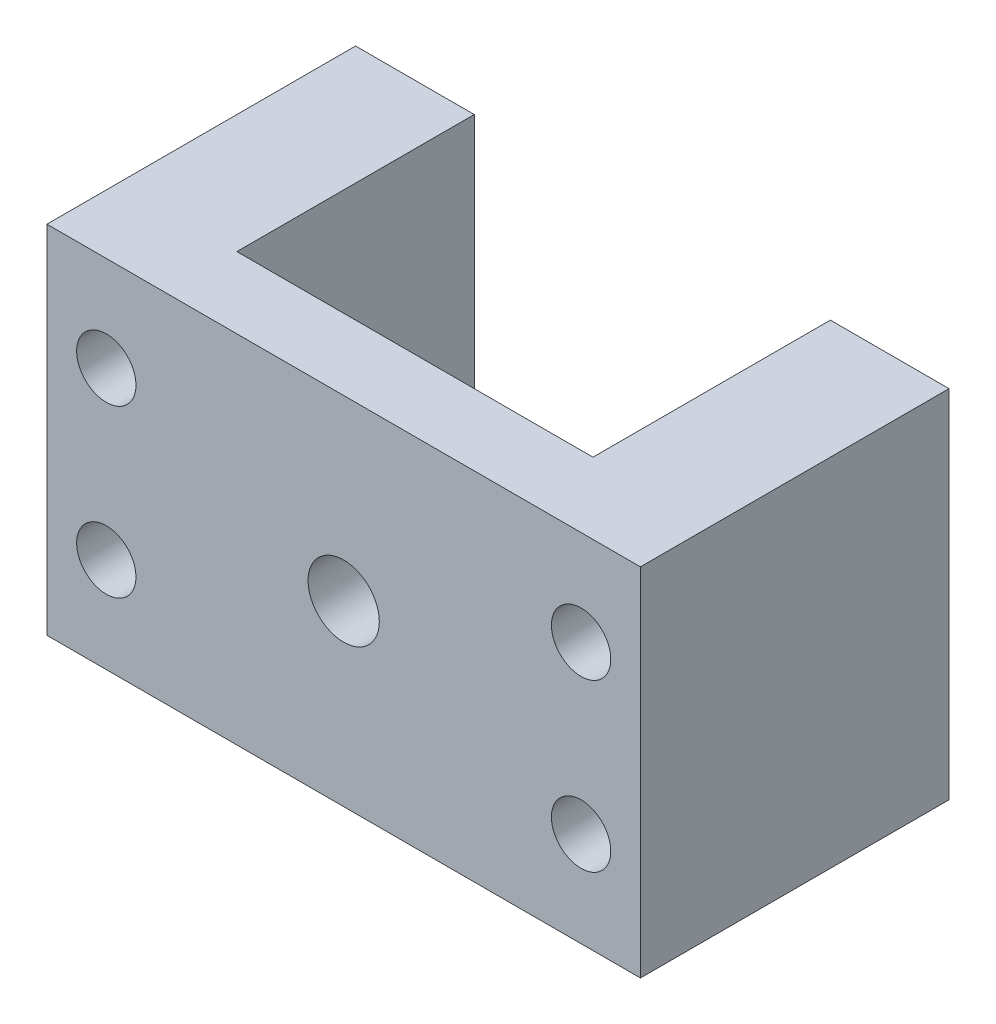
ISO-10303-21;
HEADER;
FILE_DESCRIPTION(('STEP AP214'),'2;1');
FILE_NAME('part.step','',(''),(''),'','','');
FILE_SCHEMA(('AUTOMOTIVE_DESIGN { 1 0 10303 214 1 1 1 1 }'));
ENDSEC;
DATA;
#1=APPLICATION_CONTEXT('core data for automotive mechanical design processes');
#2=APPLICATION_PROTOCOL_DEFINITION('international standard','automotive_design',2000,#1);
#3=PRODUCT_CONTEXT('',#1,'mechanical');
#4=PRODUCT('Part','Part','',(#3));
#5=PRODUCT_RELATED_PRODUCT_CATEGORY('part','',(#4));
#6=PRODUCT_DEFINITION_FORMATION('','',#4);
#7=PRODUCT_DEFINITION_CONTEXT('part definition',#1,'design');
#8=PRODUCT_DEFINITION('design','',#6,#7);
#9=PRODUCT_DEFINITION_SHAPE('','',#8);
#10=(LENGTH_UNIT() NAMED_UNIT(*) SI_UNIT(.MILLI.,.METRE.));
#11=(NAMED_UNIT(*) PLANE_ANGLE_UNIT() SI_UNIT($,.RADIAN.));
#12=(NAMED_UNIT(*) SI_UNIT($,.STERADIAN.) SOLID_ANGLE_UNIT());
#13=UNCERTAINTY_MEASURE_WITH_UNIT(LENGTH_MEASURE(1.E-05),#10,'distance_accuracy_value','');
#14=(GEOMETRIC_REPRESENTATION_CONTEXT(3) GLOBAL_UNCERTAINTY_ASSIGNED_CONTEXT((#13)) GLOBAL_UNIT_ASSIGNED_CONTEXT((#10,
#11,#12)) REPRESENTATION_CONTEXT('',''));
#15=CARTESIAN_POINT('',(0.,0.,0.));
#16=DIRECTION('',(0.,0.,1.));
#17=DIRECTION('',(1.,0.,0.));
#18=AXIS2_PLACEMENT_3D('',#15,#16,#17);
#19=CARTESIAN_POINT('',(-5.,15.,0.));
#20=DIRECTION('',(1.,0.,0.));
#21=DIRECTION('',(0.,0.,-1.));
#22=AXIS2_PLACEMENT_3D('',#19,#20,#21);
#23=PLANE('',#22);
#24=DIRECTION('',(0.,-1.,0.));
#25=VECTOR('',#24,1.);
#26=CARTESIAN_POINT('',(-5.,15.,14.));
#27=LINE('',#26,#25);
#28=CARTESIAN_POINT('',(-5.,15.,14.));
#29=VERTEX_POINT('',#28);
#30=CARTESIAN_POINT('',(-5.,0.,14.));
#31=VERTEX_POINT('',#30);
#32=EDGE_CURVE('E52',#29,#31,#27,.T.);
#33=ORIENTED_EDGE('',*,*,#32,.F.);
#34=DIRECTION('',(0.,0.,1.));
#35=VECTOR('',#34,1.);
#36=CARTESIAN_POINT('',(-5.,15.,0.));
#37=LINE('',#36,#35);
#38=CARTESIAN_POINT('',(-5.,15.,1.));
#39=VERTEX_POINT('',#38);
#40=EDGE_CURVE('E165',#39,#29,#37,.T.);
#41=ORIENTED_EDGE('',*,*,#40,.F.);
#42=DIRECTION('',(0.,1.,0.));
#43=VECTOR('',#42,1.);
#44=CARTESIAN_POINT('',(-5.,15.,1.));
#45=LINE('',#44,#43);
#46=CARTESIAN_POINT('',(-5.,0.,1.));
#47=VERTEX_POINT('',#46);
#48=EDGE_CURVE('E151',#47,#39,#45,.T.);
#49=ORIENTED_EDGE('',*,*,#48,.F.);
#50=DIRECTION('',(0.,0.,1.));
#51=VECTOR('',#50,1.);
#52=CARTESIAN_POINT('',(-5.,0.,0.));
#53=LINE('',#52,#51);
#54=EDGE_CURVE('E120',#47,#31,#53,.T.);
#55=ORIENTED_EDGE('',*,*,#54,.T.);
#56=EDGE_LOOP('',(#33,#41,#49,#55));
#57=FACE_BOUND('',#56,.T.);
#58=ADVANCED_FACE('F35',(#57),#23,.F.);
#59=CARTESIAN_POINT('',(20.,15.,0.));
#60=DIRECTION('',(-1.,0.,0.));
#61=DIRECTION('',(0.,0.,1.));
#62=AXIS2_PLACEMENT_3D('',#59,#60,#61);
#63=PLANE('',#62);
#64=DIRECTION('',(0.,1.,0.));
#65=VECTOR('',#64,1.);
#66=CARTESIAN_POINT('',(20.,15.,14.));
#67=LINE('',#66,#65);
#68=CARTESIAN_POINT('',(20.,0.,14.));
#69=VERTEX_POINT('',#68);
#70=CARTESIAN_POINT('',(20.,15.,14.));
#71=VERTEX_POINT('',#70);
#72=EDGE_CURVE('E104',#69,#71,#67,.T.);
#73=ORIENTED_EDGE('',*,*,#72,.F.);
#74=DIRECTION('',(0.,0.,-1.));
#75=VECTOR('',#74,1.);
#76=CARTESIAN_POINT('',(20.,0.,0.));
#77=LINE('',#76,#75);
#78=CARTESIAN_POINT('',(20.,0.,1.));
#79=VERTEX_POINT('',#78);
#80=EDGE_CURVE('E60',#69,#79,#77,.T.);
#81=ORIENTED_EDGE('',*,*,#80,.T.);
#82=DIRECTION('',(0.,-1.,0.));
#83=VECTOR('',#82,1.);
#84=CARTESIAN_POINT('',(20.,15.,1.));
#85=LINE('',#84,#83);
#86=CARTESIAN_POINT('',(20.,15.,1.));
#87=VERTEX_POINT('',#86);
#88=EDGE_CURVE('E180',#87,#79,#85,.T.);
#89=ORIENTED_EDGE('',*,*,#88,.F.);
#90=DIRECTION('',(0.,0.,-1.));
#91=VECTOR('',#90,1.);
#92=CARTESIAN_POINT('',(20.,15.,0.));
#93=LINE('',#92,#91);
#94=EDGE_CURVE('E112',#71,#87,#93,.T.);
#95=ORIENTED_EDGE('',*,*,#94,.F.);
#96=EDGE_LOOP('',(#73,#81,#89,#95));
#97=FACE_BOUND('',#96,.T.);
#98=ADVANCED_FACE('F111',(#97),#63,.F.);
#99=CARTESIAN_POINT('',(0.,15.,0.));
#100=DIRECTION('',(0.,1.,0.));
#101=DIRECTION('',(0.,0.,1.));
#102=AXIS2_PLACEMENT_3D('',#99,#100,#101);
#103=PLANE('',#102);
#104=ORIENTED_EDGE('',*,*,#40,.T.);
#105=DIRECTION('',(-1.,0.,0.));
#106=VECTOR('',#105,1.);
#107=CARTESIAN_POINT('',(-5.,15.,14.));
#108=LINE('',#107,#106);
#109=EDGE_CURVE('E113',#71,#29,#108,.T.);
#110=ORIENTED_EDGE('',*,*,#109,.F.);
#111=ORIENTED_EDGE('',*,*,#94,.T.);
#112=DIRECTION('',(1.,0.,0.));
#113=VECTOR('',#112,1.);
#114=CARTESIAN_POINT('',(20.,15.,1.));
#115=LINE('',#114,#113);
#116=CARTESIAN_POINT('',(15.,15.,1.));
#117=VERTEX_POINT('',#116);
#118=EDGE_CURVE('E145',#117,#87,#115,.T.);
#119=ORIENTED_EDGE('',*,*,#118,.F.);
#120=DIRECTION('',(0.,0.,1.));
#121=VECTOR('',#120,1.);
#122=CARTESIAN_POINT('',(15.,15.,0.));
#123=LINE('',#122,#121);
#124=CARTESIAN_POINT('',(15.,15.,11.));
#125=VERTEX_POINT('',#124);
#126=EDGE_CURVE('E169',#117,#125,#123,.T.);
#127=ORIENTED_EDGE('',*,*,#126,.T.);
#128=DIRECTION('',(-1.,0.,0.));
#129=VECTOR('',#128,1.);
#130=CARTESIAN_POINT('',(0.,15.,11.));
#131=LINE('',#130,#129);
#132=CARTESIAN_POINT('',(0.,15.,11.));
#133=VERTEX_POINT('',#132);
#134=EDGE_CURVE('E131',#125,#133,#131,.T.);
#135=ORIENTED_EDGE('',*,*,#134,.T.);
#136=DIRECTION('',(0.,0.,-1.));
#137=VECTOR('',#136,1.);
#138=CARTESIAN_POINT('',(0.,15.,0.));
#139=LINE('',#138,#137);
#140=CARTESIAN_POINT('',(0.,15.,1.));
#141=VERTEX_POINT('',#140);
#142=EDGE_CURVE('E129',#133,#141,#139,.T.);
#143=ORIENTED_EDGE('',*,*,#142,.T.);
#144=EDGE_CURVE('E139',#39,#141,#115,.T.);
#145=ORIENTED_EDGE('',*,*,#144,.F.);
#146=EDGE_LOOP('',(#104,#110,#111,#119,#127,#135,#143,#145));
#147=FACE_BOUND('',#146,.T.);
#148=ADVANCED_FACE('F220',(#147),#103,.T.);
#149=CARTESIAN_POINT('',(0.,0.,0.));
#150=DIRECTION('',(0.,1.,0.));
#151=DIRECTION('',(0.,0.,1.));
#152=AXIS2_PLACEMENT_3D('',#149,#150,#151);
#153=PLANE('',#152);
#154=DIRECTION('',(1.,0.,0.));
#155=VECTOR('',#154,1.);
#156=CARTESIAN_POINT('',(-5.,0.,14.));
#157=LINE('',#156,#155);
#158=EDGE_CURVE('E101',#31,#69,#157,.T.);
#159=ORIENTED_EDGE('',*,*,#158,.F.);
#160=ORIENTED_EDGE('',*,*,#54,.F.);
#161=DIRECTION('',(-1.,0.,0.));
#162=VECTOR('',#161,1.);
#163=CARTESIAN_POINT('',(20.,0.,1.));
#164=LINE('',#163,#162);
#165=CARTESIAN_POINT('',(0.,0.,1.));
#166=VERTEX_POINT('',#165);
#167=EDGE_CURVE('E178',#166,#47,#164,.T.);
#168=ORIENTED_EDGE('',*,*,#167,.F.);
#169=DIRECTION('',(0.,0.,-1.));
#170=VECTOR('',#169,1.);
#171=CARTESIAN_POINT('',(0.,0.,0.));
#172=LINE('',#171,#170);
#173=CARTESIAN_POINT('',(0.,0.,11.));
#174=VERTEX_POINT('',#173);
#175=EDGE_CURVE('E124',#174,#166,#172,.T.);
#176=ORIENTED_EDGE('',*,*,#175,.F.);
#177=DIRECTION('',(-1.,0.,0.));
#178=VECTOR('',#177,1.);
#179=CARTESIAN_POINT('',(0.,0.,11.));
#180=LINE('',#179,#178);
#181=CARTESIAN_POINT('',(15.,0.,11.));
#182=VERTEX_POINT('',#181);
#183=EDGE_CURVE('E122',#182,#174,#180,.T.);
#184=ORIENTED_EDGE('',*,*,#183,.F.);
#185=DIRECTION('',(0.,0.,1.));
#186=VECTOR('',#185,1.);
#187=CARTESIAN_POINT('',(15.,0.,0.));
#188=LINE('',#187,#186);
#189=CARTESIAN_POINT('',(15.,0.,1.));
#190=VERTEX_POINT('',#189);
#191=EDGE_CURVE('E119',#190,#182,#188,.T.);
#192=ORIENTED_EDGE('',*,*,#191,.F.);
#193=EDGE_CURVE('E118',#79,#190,#164,.T.);
#194=ORIENTED_EDGE('',*,*,#193,.F.);
#195=ORIENTED_EDGE('',*,*,#80,.F.);
#196=EDGE_LOOP('',(#159,#160,#168,#176,#184,#192,#194,#195));
#197=FACE_BOUND('',#196,.T.);
#198=ADVANCED_FACE('F116',(#197),#153,.F.);
#199=CARTESIAN_POINT('',(17.5,11.,15.));
#200=DIRECTION('',(0.,0.,-1.));
#201=DIRECTION('',(-1.,0.,0.));
#202=AXIS2_PLACEMENT_3D('',#199,#200,#201);
#203=CYLINDRICAL_SURFACE('',#202,1.25);
#204=CARTESIAN_POINT('',(17.5,11.,0.999999999999999));
#205=DIRECTION('',(0.,0.,-1.));
#206=DIRECTION('',(-1.,0.,0.));
#207=AXIS2_PLACEMENT_3D('',#204,#205,#206);
#208=CIRCLE('',#207,1.25);
#209=CARTESIAN_POINT('',(16.25,11.,1.));
#210=VERTEX_POINT('',#209);
#211=EDGE_CURVE('E157',#210,#210,#208,.F.);
#212=CARTESIAN_POINT('',(17.5,11.,14.));
#213=DIRECTION('',(0.,0.,1.));
#214=DIRECTION('',(1.,0.,0.));
#215=AXIS2_PLACEMENT_3D('',#212,#213,#214);
#216=CIRCLE('',#215,1.25);
#217=CARTESIAN_POINT('',(16.25,11.,14.));
#218=VERTEX_POINT('',#217);
#219=EDGE_CURVE('E181',#218,#218,#216,.F.);
#220=CARTESIAN_POINT('',(16.25,11.,1.));
#221=CARTESIAN_POINT('',(16.25,11.,1.13541666666667));
#222=CARTESIAN_POINT('',(16.25,11.,1.27083333333333));
#223=CARTESIAN_POINT('',(16.25,11.,1.54166666666667));
#224=CARTESIAN_POINT('',(16.25,11.,1.67708333333333));
#225=CARTESIAN_POINT('',(16.25,11.,1.94791666666667));
#226=CARTESIAN_POINT('',(16.25,11.,2.08333333333333));
#227=CARTESIAN_POINT('',(16.25,11.,2.35416666666667));
#228=CARTESIAN_POINT('',(16.25,11.,2.48958333333333));
#229=CARTESIAN_POINT('',(16.25,11.,2.76041666666667));
#230=CARTESIAN_POINT('',(16.25,11.,2.89583333333333));
#231=CARTESIAN_POINT('',(16.25,11.,3.16666666666667));
#232=CARTESIAN_POINT('',(16.25,11.,3.30208333333333));
#233=CARTESIAN_POINT('',(16.25,11.,3.57291666666667));
#234=CARTESIAN_POINT('',(16.25,11.,3.70833333333333));
#235=CARTESIAN_POINT('',(16.25,11.,3.97916666666667));
#236=CARTESIAN_POINT('',(16.25,11.,4.11458333333333));
#237=CARTESIAN_POINT('',(16.25,11.,4.38541666666667));
#238=CARTESIAN_POINT('',(16.25,11.,4.52083333333333));
#239=CARTESIAN_POINT('',(16.25,11.,4.79166666666667));
#240=CARTESIAN_POINT('',(16.25,11.,4.92708333333333));
#241=CARTESIAN_POINT('',(16.25,11.,5.19791666666667));
#242=CARTESIAN_POINT('',(16.25,11.,5.33333333333333));
#243=CARTESIAN_POINT('',(16.25,11.,5.60416666666667));
#244=CARTESIAN_POINT('',(16.25,11.,5.73958333333333));
#245=CARTESIAN_POINT('',(16.25,11.,6.01041666666667));
#246=CARTESIAN_POINT('',(16.25,11.,6.14583333333333));
#247=CARTESIAN_POINT('',(16.25,11.,6.41666666666667));
#248=CARTESIAN_POINT('',(16.25,11.,6.55208333333333));
#249=CARTESIAN_POINT('',(16.25,11.,6.82291666666667));
#250=CARTESIAN_POINT('',(16.25,11.,6.95833333333333));
#251=CARTESIAN_POINT('',(16.25,11.,7.22916666666667));
#252=CARTESIAN_POINT('',(16.25,11.,7.36458333333333));
#253=CARTESIAN_POINT('',(16.25,11.,7.63541666666667));
#254=CARTESIAN_POINT('',(16.25,11.,7.77083333333333));
#255=CARTESIAN_POINT('',(16.25,11.,8.04166666666667));
#256=CARTESIAN_POINT('',(16.25,11.,8.17708333333333));
#257=CARTESIAN_POINT('',(16.25,11.,8.44791666666666));
#258=CARTESIAN_POINT('',(16.25,11.,8.58333333333333));
#259=CARTESIAN_POINT('',(16.25,11.,8.85416666666666));
#260=CARTESIAN_POINT('',(16.25,11.,8.98958333333333));
#261=CARTESIAN_POINT('',(16.25,11.,9.26041666666666));
#262=CARTESIAN_POINT('',(16.25,11.,9.39583333333333));
#263=CARTESIAN_POINT('',(16.25,11.,9.66666666666667));
#264=CARTESIAN_POINT('',(16.25,11.,9.80208333333333));
#265=CARTESIAN_POINT('',(16.25,11.,10.0729166666667));
#266=CARTESIAN_POINT('',(16.25,11.,10.2083333333333));
#267=CARTESIAN_POINT('',(16.25,11.,10.4791666666667));
#268=CARTESIAN_POINT('',(16.25,11.,10.6145833333333));
#269=CARTESIAN_POINT('',(16.25,11.,10.8854166666667));
#270=CARTESIAN_POINT('',(16.25,11.,11.0208333333333));
#271=CARTESIAN_POINT('',(16.25,11.,11.2916666666667));
#272=CARTESIAN_POINT('',(16.25,11.,11.4270833333333));
#273=CARTESIAN_POINT('',(16.25,11.,11.6979166666667));
#274=CARTESIAN_POINT('',(16.25,11.,11.8333333333333));
#275=CARTESIAN_POINT('',(16.25,11.,12.1041666666667));
#276=CARTESIAN_POINT('',(16.25,11.,12.2395833333333));
#277=CARTESIAN_POINT('',(16.25,11.,12.5104166666667));
#278=CARTESIAN_POINT('',(16.25,11.,12.6458333333333));
#279=CARTESIAN_POINT('',(16.25,11.,12.9166666666667));
#280=CARTESIAN_POINT('',(16.25,11.,13.0520833333333));
#281=CARTESIAN_POINT('',(16.25,11.,13.3229166666667));
#282=CARTESIAN_POINT('',(16.25,11.,13.4583333333333));
#283=CARTESIAN_POINT('',(16.25,11.,13.7291666666667));
#284=CARTESIAN_POINT('',(16.25,11.,13.8645833333333));
#285=CARTESIAN_POINT('',(16.25,11.,14.));
#286=B_SPLINE_CURVE_WITH_KNOTS('',3,(#220,#221,#222,#223,#224,#225,#226,#227,#228,#229,#230,
#231,#232,#233,#234,#235,#236,#237,#238,#239,#240,#241,#242,#243,#244,#245,#246,#247,#248,#249,
#250,#251,#252,#253,#254,#255,#256,#257,#258,#259,#260,#261,#262,#263,#264,#265,#266,#267,#268,
#269,#270,#271,#272,#273,#274,#275,#276,#277,#278,#279,#280,#281,#282,#283,#284,#285),
.UNSPECIFIED.,.F.,.F.,(4,2,2,2,2,2,2,2,2,2,2,2,2,2,2,2,2,2,2,2,2,2,2,2,2,2,2,2,2,2,2,2,4),(0.,
0.40625,0.812500000000001,1.21875,1.625,2.03125,2.4375,2.84375,3.25,3.65625,4.0625,4.46875,
4.875,5.28125,5.6875,6.09375,6.5,6.90625,7.3125,7.71875,8.125,8.53125,8.9375,9.34375,9.75,
10.15625,10.5625,10.96875,11.375,11.78125,12.1875,12.59375,13.),.UNSPECIFIED.);
#287=EDGE_CURVE('BSEAM233',#210,#218,#286,.T.);
#288=ORIENTED_EDGE('',*,*,#211,.F.);
#289=ORIENTED_EDGE('',*,*,#219,.F.);
#290=ORIENTED_EDGE('',*,*,#287,.T.);
#291=ORIENTED_EDGE('',*,*,#287,.F.);
#292=EDGE_LOOP('',(#288,#290,#289,#291));
#293=FACE_BOUND('',#292,.T.);
#294=ADVANCED_FACE('F233',(#293),#203,.F.);
#295=CARTESIAN_POINT('',(17.5,4.,15.));
#296=DIRECTION('',(0.,0.,-1.));
#297=DIRECTION('',(-1.,0.,0.));
#298=AXIS2_PLACEMENT_3D('',#295,#296,#297);
#299=CYLINDRICAL_SURFACE('',#298,1.25);
#300=CARTESIAN_POINT('',(17.5,4.,0.999999999999999));
#301=DIRECTION('',(0.,0.,-1.));
#302=DIRECTION('',(-1.,0.,0.));
#303=AXIS2_PLACEMENT_3D('',#300,#301,#302);
#304=CIRCLE('',#303,1.25);
#305=CARTESIAN_POINT('',(16.25,4.,1.));
#306=VERTEX_POINT('',#305);
#307=EDGE_CURVE('E143',#306,#306,#304,.F.);
#308=CARTESIAN_POINT('',(17.5,4.,14.));
#309=DIRECTION('',(0.,0.,1.));
#310=DIRECTION('',(1.,0.,0.));
#311=AXIS2_PLACEMENT_3D('',#308,#309,#310);
#312=CIRCLE('',#311,1.25);
#313=CARTESIAN_POINT('',(16.25,4.,14.));
#314=VERTEX_POINT('',#313);
#315=EDGE_CURVE('E186',#314,#314,#312,.F.);
#316=CARTESIAN_POINT('',(16.25,4.,1.));
#317=CARTESIAN_POINT('',(16.25,4.,1.13541666666667));
#318=CARTESIAN_POINT('',(16.25,4.,1.27083333333333));
#319=CARTESIAN_POINT('',(16.25,4.,1.54166666666667));
#320=CARTESIAN_POINT('',(16.25,4.,1.67708333333333));
#321=CARTESIAN_POINT('',(16.25,4.,1.94791666666667));
#322=CARTESIAN_POINT('',(16.25,4.,2.08333333333333));
#323=CARTESIAN_POINT('',(16.25,4.,2.35416666666667));
#324=CARTESIAN_POINT('',(16.25,4.,2.48958333333333));
#325=CARTESIAN_POINT('',(16.25,4.,2.76041666666667));
#326=CARTESIAN_POINT('',(16.25,4.,2.89583333333333));
#327=CARTESIAN_POINT('',(16.25,4.,3.16666666666667));
#328=CARTESIAN_POINT('',(16.25,4.,3.30208333333333));
#329=CARTESIAN_POINT('',(16.25,4.,3.57291666666667));
#330=CARTESIAN_POINT('',(16.25,4.,3.70833333333333));
#331=CARTESIAN_POINT('',(16.25,4.,3.97916666666667));
#332=CARTESIAN_POINT('',(16.25,4.,4.11458333333333));
#333=CARTESIAN_POINT('',(16.25,4.,4.38541666666667));
#334=CARTESIAN_POINT('',(16.25,4.,4.52083333333333));
#335=CARTESIAN_POINT('',(16.25,4.,4.79166666666667));
#336=CARTESIAN_POINT('',(16.25,4.,4.92708333333333));
#337=CARTESIAN_POINT('',(16.25,4.,5.19791666666667));
#338=CARTESIAN_POINT('',(16.25,4.,5.33333333333333));
#339=CARTESIAN_POINT('',(16.25,4.,5.60416666666667));
#340=CARTESIAN_POINT('',(16.25,4.,5.73958333333333));
#341=CARTESIAN_POINT('',(16.25,4.,6.01041666666667));
#342=CARTESIAN_POINT('',(16.25,4.,6.14583333333333));
#343=CARTESIAN_POINT('',(16.25,4.,6.41666666666667));
#344=CARTESIAN_POINT('',(16.25,4.,6.55208333333333));
#345=CARTESIAN_POINT('',(16.25,4.,6.82291666666667));
#346=CARTESIAN_POINT('',(16.25,4.,6.95833333333333));
#347=CARTESIAN_POINT('',(16.25,4.,7.22916666666667));
#348=CARTESIAN_POINT('',(16.25,4.,7.36458333333333));
#349=CARTESIAN_POINT('',(16.25,4.,7.63541666666667));
#350=CARTESIAN_POINT('',(16.25,4.,7.77083333333333));
#351=CARTESIAN_POINT('',(16.25,4.,8.04166666666667));
#352=CARTESIAN_POINT('',(16.25,4.,8.17708333333333));
#353=CARTESIAN_POINT('',(16.25,4.,8.44791666666666));
#354=CARTESIAN_POINT('',(16.25,4.,8.58333333333333));
#355=CARTESIAN_POINT('',(16.25,4.,8.85416666666666));
#356=CARTESIAN_POINT('',(16.25,4.,8.98958333333333));
#357=CARTESIAN_POINT('',(16.25,4.,9.26041666666666));
#358=CARTESIAN_POINT('',(16.25,4.,9.39583333333333));
#359=CARTESIAN_POINT('',(16.25,4.,9.66666666666667));
#360=CARTESIAN_POINT('',(16.25,4.,9.80208333333333));
#361=CARTESIAN_POINT('',(16.25,4.,10.0729166666667));
#362=CARTESIAN_POINT('',(16.25,4.,10.2083333333333));
#363=CARTESIAN_POINT('',(16.25,4.,10.4791666666667));
#364=CARTESIAN_POINT('',(16.25,4.,10.6145833333333));
#365=CARTESIAN_POINT('',(16.25,4.,10.8854166666667));
#366=CARTESIAN_POINT('',(16.25,4.,11.0208333333333));
#367=CARTESIAN_POINT('',(16.25,4.,11.2916666666667));
#368=CARTESIAN_POINT('',(16.25,4.,11.4270833333333));
#369=CARTESIAN_POINT('',(16.25,4.,11.6979166666667));
#370=CARTESIAN_POINT('',(16.25,4.,11.8333333333333));
#371=CARTESIAN_POINT('',(16.25,4.,12.1041666666667));
#372=CARTESIAN_POINT('',(16.25,4.,12.2395833333333));
#373=CARTESIAN_POINT('',(16.25,4.,12.5104166666667));
#374=CARTESIAN_POINT('',(16.25,4.,12.6458333333333));
#375=CARTESIAN_POINT('',(16.25,4.,12.9166666666667));
#376=CARTESIAN_POINT('',(16.25,4.,13.0520833333333));
#377=CARTESIAN_POINT('',(16.25,4.,13.3229166666667));
#378=CARTESIAN_POINT('',(16.25,4.,13.4583333333333));
#379=CARTESIAN_POINT('',(16.25,4.,13.7291666666667));
#380=CARTESIAN_POINT('',(16.25,4.,13.8645833333333));
#381=CARTESIAN_POINT('',(16.25,4.,14.));
#382=B_SPLINE_CURVE_WITH_KNOTS('',3,(#316,#317,#318,#319,#320,#321,#322,#323,#324,#325,#326,
#327,#328,#329,#330,#331,#332,#333,#334,#335,#336,#337,#338,#339,#340,#341,#342,#343,#344,#345,
#346,#347,#348,#349,#350,#351,#352,#353,#354,#355,#356,#357,#358,#359,#360,#361,#362,#363,#364,
#365,#366,#367,#368,#369,#370,#371,#372,#373,#374,#375,#376,#377,#378,#379,#380,#381),
.UNSPECIFIED.,.F.,.F.,(4,2,2,2,2,2,2,2,2,2,2,2,2,2,2,2,2,2,2,2,2,2,2,2,2,2,2,2,2,2,2,2,4),(0.,
0.40625,0.812500000000001,1.21875,1.625,2.03125,2.4375,2.84375,3.25,3.65625,4.0625,4.46875,
4.875,5.28125,5.6875,6.09375,6.5,6.90625,7.3125,7.71875,8.125,8.53125,8.9375,9.34375,9.75,
10.15625,10.5625,10.96875,11.375,11.78125,12.1875,12.59375,13.),.UNSPECIFIED.);
#383=EDGE_CURVE('BSEAM239',#306,#314,#382,.T.);
#384=ORIENTED_EDGE('',*,*,#307,.F.);
#385=ORIENTED_EDGE('',*,*,#315,.F.);
#386=ORIENTED_EDGE('',*,*,#383,.T.);
#387=ORIENTED_EDGE('',*,*,#383,.F.);
#388=EDGE_LOOP('',(#384,#386,#385,#387));
#389=FACE_BOUND('',#388,.T.);
#390=ADVANCED_FACE('F239',(#389),#299,.F.);
#391=CARTESIAN_POINT('',(-2.5,11.,15.));
#392=DIRECTION('',(0.,0.,-1.));
#393=DIRECTION('',(-1.,0.,0.));
#394=AXIS2_PLACEMENT_3D('',#391,#392,#393);
#395=CYLINDRICAL_SURFACE('',#394,1.25);
#396=CARTESIAN_POINT('',(-2.5,11.,0.999999999999999));
#397=DIRECTION('',(0.,0.,-1.));
#398=DIRECTION('',(-1.,0.,0.));
#399=AXIS2_PLACEMENT_3D('',#396,#397,#398);
#400=CIRCLE('',#399,1.25);
#401=CARTESIAN_POINT('',(-3.75,11.,1.));
#402=VERTEX_POINT('',#401);
#403=EDGE_CURVE('E138',#402,#402,#400,.F.);
#404=CARTESIAN_POINT('',(-2.5,11.,14.));
#405=DIRECTION('',(0.,0.,1.));
#406=DIRECTION('',(1.,0.,0.));
#407=AXIS2_PLACEMENT_3D('',#404,#405,#406);
#408=CIRCLE('',#407,1.25);
#409=CARTESIAN_POINT('',(-3.75,11.,14.));
#410=VERTEX_POINT('',#409);
#411=EDGE_CURVE('E189',#410,#410,#408,.F.);
#412=CARTESIAN_POINT('',(-3.75,11.,1.));
#413=CARTESIAN_POINT('',(-3.75,11.,1.13541666666667));
#414=CARTESIAN_POINT('',(-3.75,11.,1.27083333333333));
#415=CARTESIAN_POINT('',(-3.75,11.,1.54166666666667));
#416=CARTESIAN_POINT('',(-3.75,11.,1.67708333333333));
#417=CARTESIAN_POINT('',(-3.75,11.,1.94791666666667));
#418=CARTESIAN_POINT('',(-3.75,11.,2.08333333333333));
#419=CARTESIAN_POINT('',(-3.75,11.,2.35416666666667));
#420=CARTESIAN_POINT('',(-3.75,11.,2.48958333333333));
#421=CARTESIAN_POINT('',(-3.75,11.,2.76041666666667));
#422=CARTESIAN_POINT('',(-3.75,11.,2.89583333333333));
#423=CARTESIAN_POINT('',(-3.75,11.,3.16666666666667));
#424=CARTESIAN_POINT('',(-3.75,11.,3.30208333333333));
#425=CARTESIAN_POINT('',(-3.75,11.,3.57291666666667));
#426=CARTESIAN_POINT('',(-3.75,11.,3.70833333333333));
#427=CARTESIAN_POINT('',(-3.75,11.,3.97916666666667));
#428=CARTESIAN_POINT('',(-3.75,11.,4.11458333333333));
#429=CARTESIAN_POINT('',(-3.75,11.,4.38541666666667));
#430=CARTESIAN_POINT('',(-3.75,11.,4.52083333333333));
#431=CARTESIAN_POINT('',(-3.75,11.,4.79166666666667));
#432=CARTESIAN_POINT('',(-3.75,11.,4.92708333333333));
#433=CARTESIAN_POINT('',(-3.75,11.,5.19791666666667));
#434=CARTESIAN_POINT('',(-3.75,11.,5.33333333333333));
#435=CARTESIAN_POINT('',(-3.75,11.,5.60416666666667));
#436=CARTESIAN_POINT('',(-3.75,11.,5.73958333333333));
#437=CARTESIAN_POINT('',(-3.75,11.,6.01041666666667));
#438=CARTESIAN_POINT('',(-3.75,11.,6.14583333333333));
#439=CARTESIAN_POINT('',(-3.75,11.,6.41666666666667));
#440=CARTESIAN_POINT('',(-3.75,11.,6.55208333333333));
#441=CARTESIAN_POINT('',(-3.75,11.,6.82291666666667));
#442=CARTESIAN_POINT('',(-3.75,11.,6.95833333333333));
#443=CARTESIAN_POINT('',(-3.75,11.,7.22916666666667));
#444=CARTESIAN_POINT('',(-3.75,11.,7.36458333333333));
#445=CARTESIAN_POINT('',(-3.75,11.,7.63541666666667));
#446=CARTESIAN_POINT('',(-3.75,11.,7.77083333333333));
#447=CARTESIAN_POINT('',(-3.75,11.,8.04166666666667));
#448=CARTESIAN_POINT('',(-3.75,11.,8.17708333333333));
#449=CARTESIAN_POINT('',(-3.75,11.,8.44791666666666));
#450=CARTESIAN_POINT('',(-3.75,11.,8.58333333333333));
#451=CARTESIAN_POINT('',(-3.75,11.,8.85416666666666));
#452=CARTESIAN_POINT('',(-3.75,11.,8.98958333333333));
#453=CARTESIAN_POINT('',(-3.75,11.,9.26041666666666));
#454=CARTESIAN_POINT('',(-3.75,11.,9.39583333333333));
#455=CARTESIAN_POINT('',(-3.75,11.,9.66666666666667));
#456=CARTESIAN_POINT('',(-3.75,11.,9.80208333333333));
#457=CARTESIAN_POINT('',(-3.75,11.,10.0729166666667));
#458=CARTESIAN_POINT('',(-3.75,11.,10.2083333333333));
#459=CARTESIAN_POINT('',(-3.75,11.,10.4791666666667));
#460=CARTESIAN_POINT('',(-3.75,11.,10.6145833333333));
#461=CARTESIAN_POINT('',(-3.75,11.,10.8854166666667));
#462=CARTESIAN_POINT('',(-3.75,11.,11.0208333333333));
#463=CARTESIAN_POINT('',(-3.75,11.,11.2916666666667));
#464=CARTESIAN_POINT('',(-3.75,11.,11.4270833333333));
#465=CARTESIAN_POINT('',(-3.75,11.,11.6979166666667));
#466=CARTESIAN_POINT('',(-3.75,11.,11.8333333333333));
#467=CARTESIAN_POINT('',(-3.75,11.,12.1041666666667));
#468=CARTESIAN_POINT('',(-3.75,11.,12.2395833333333));
#469=CARTESIAN_POINT('',(-3.75,11.,12.5104166666667));
#470=CARTESIAN_POINT('',(-3.75,11.,12.6458333333333));
#471=CARTESIAN_POINT('',(-3.75,11.,12.9166666666667));
#472=CARTESIAN_POINT('',(-3.75,11.,13.0520833333333));
#473=CARTESIAN_POINT('',(-3.75,11.,13.3229166666667));
#474=CARTESIAN_POINT('',(-3.75,11.,13.4583333333333));
#475=CARTESIAN_POINT('',(-3.75,11.,13.7291666666667));
#476=CARTESIAN_POINT('',(-3.75,11.,13.8645833333333));
#477=CARTESIAN_POINT('',(-3.75,11.,14.));
#478=B_SPLINE_CURVE_WITH_KNOTS('',3,(#412,#413,#414,#415,#416,#417,#418,#419,#420,#421,#422,
#423,#424,#425,#426,#427,#428,#429,#430,#431,#432,#433,#434,#435,#436,#437,#438,#439,#440,#441,
#442,#443,#444,#445,#446,#447,#448,#449,#450,#451,#452,#453,#454,#455,#456,#457,#458,#459,#460,
#461,#462,#463,#464,#465,#466,#467,#468,#469,#470,#471,#472,#473,#474,#475,#476,#477),
.UNSPECIFIED.,.F.,.F.,(4,2,2,2,2,2,2,2,2,2,2,2,2,2,2,2,2,2,2,2,2,2,2,2,2,2,2,2,2,2,2,2,4),(0.,
0.40625,0.812500000000001,1.21875,1.625,2.03125,2.4375,2.84375,3.25,3.65625,4.0625,4.46875,
4.875,5.28125,5.6875,6.09375,6.5,6.90625,7.3125,7.71875,8.125,8.53125,8.9375,9.34375,9.75,
10.15625,10.5625,10.96875,11.375,11.78125,12.1875,12.59375,13.),.UNSPECIFIED.);
#479=EDGE_CURVE('BSEAM210',#402,#410,#478,.T.);
#480=ORIENTED_EDGE('',*,*,#403,.F.);
#481=ORIENTED_EDGE('',*,*,#411,.F.);
#482=ORIENTED_EDGE('',*,*,#479,.T.);
#483=ORIENTED_EDGE('',*,*,#479,.F.);
#484=EDGE_LOOP('',(#480,#482,#481,#483));
#485=FACE_BOUND('',#484,.T.);
#486=ADVANCED_FACE('F210',(#485),#395,.F.);
#487=CARTESIAN_POINT('',(-2.5,4.,15.));
#488=DIRECTION('',(0.,0.,-1.));
#489=DIRECTION('',(-1.,0.,0.));
#490=AXIS2_PLACEMENT_3D('',#487,#488,#489);
#491=CYLINDRICAL_SURFACE('',#490,1.25);
#492=CARTESIAN_POINT('',(-2.5,4.,0.999999999999999));
#493=DIRECTION('',(0.,0.,-1.));
#494=DIRECTION('',(-1.,0.,0.));
#495=AXIS2_PLACEMENT_3D('',#492,#493,#494);
#496=CIRCLE('',#495,1.25);
#497=CARTESIAN_POINT('',(-3.75,4.,1.));
#498=VERTEX_POINT('',#497);
#499=EDGE_CURVE('E136',#498,#498,#496,.F.);
#500=CARTESIAN_POINT('',(-2.5,4.,14.));
#501=DIRECTION('',(0.,0.,1.));
#502=DIRECTION('',(1.,0.,0.));
#503=AXIS2_PLACEMENT_3D('',#500,#501,#502);
#504=CIRCLE('',#503,1.25);
#505=CARTESIAN_POINT('',(-3.75,4.,14.));
#506=VERTEX_POINT('',#505);
#507=EDGE_CURVE('E192',#506,#506,#504,.F.);
#508=CARTESIAN_POINT('',(-3.75,4.,1.));
#509=CARTESIAN_POINT('',(-3.75,4.,1.13541666666667));
#510=CARTESIAN_POINT('',(-3.75,4.,1.27083333333333));
#511=CARTESIAN_POINT('',(-3.75,4.,1.54166666666667));
#512=CARTESIAN_POINT('',(-3.75,4.,1.67708333333333));
#513=CARTESIAN_POINT('',(-3.75,4.,1.94791666666667));
#514=CARTESIAN_POINT('',(-3.75,4.,2.08333333333333));
#515=CARTESIAN_POINT('',(-3.75,4.,2.35416666666667));
#516=CARTESIAN_POINT('',(-3.75,4.,2.48958333333333));
#517=CARTESIAN_POINT('',(-3.75,4.,2.76041666666667));
#518=CARTESIAN_POINT('',(-3.75,4.,2.89583333333333));
#519=CARTESIAN_POINT('',(-3.75,4.,3.16666666666667));
#520=CARTESIAN_POINT('',(-3.75,4.,3.30208333333333));
#521=CARTESIAN_POINT('',(-3.75,4.,3.57291666666667));
#522=CARTESIAN_POINT('',(-3.75,4.,3.70833333333333));
#523=CARTESIAN_POINT('',(-3.75,4.,3.97916666666667));
#524=CARTESIAN_POINT('',(-3.75,4.,4.11458333333333));
#525=CARTESIAN_POINT('',(-3.75,4.,4.38541666666667));
#526=CARTESIAN_POINT('',(-3.75,4.,4.52083333333333));
#527=CARTESIAN_POINT('',(-3.75,4.,4.79166666666667));
#528=CARTESIAN_POINT('',(-3.75,4.,4.92708333333333));
#529=CARTESIAN_POINT('',(-3.75,4.,5.19791666666667));
#530=CARTESIAN_POINT('',(-3.75,4.,5.33333333333333));
#531=CARTESIAN_POINT('',(-3.75,4.,5.60416666666667));
#532=CARTESIAN_POINT('',(-3.75,4.,5.73958333333333));
#533=CARTESIAN_POINT('',(-3.75,4.,6.01041666666667));
#534=CARTESIAN_POINT('',(-3.75,4.,6.14583333333333));
#535=CARTESIAN_POINT('',(-3.75,4.,6.41666666666667));
#536=CARTESIAN_POINT('',(-3.75,4.,6.55208333333333));
#537=CARTESIAN_POINT('',(-3.75,4.,6.82291666666667));
#538=CARTESIAN_POINT('',(-3.75,4.,6.95833333333333));
#539=CARTESIAN_POINT('',(-3.75,4.,7.22916666666667));
#540=CARTESIAN_POINT('',(-3.75,4.,7.36458333333333));
#541=CARTESIAN_POINT('',(-3.75,4.,7.63541666666667));
#542=CARTESIAN_POINT('',(-3.75,4.,7.77083333333333));
#543=CARTESIAN_POINT('',(-3.75,4.,8.04166666666667));
#544=CARTESIAN_POINT('',(-3.75,4.,8.17708333333333));
#545=CARTESIAN_POINT('',(-3.75,4.,8.44791666666666));
#546=CARTESIAN_POINT('',(-3.75,4.,8.58333333333333));
#547=CARTESIAN_POINT('',(-3.75,4.,8.85416666666666));
#548=CARTESIAN_POINT('',(-3.75,4.,8.98958333333333));
#549=CARTESIAN_POINT('',(-3.75,4.,9.26041666666666));
#550=CARTESIAN_POINT('',(-3.75,4.,9.39583333333333));
#551=CARTESIAN_POINT('',(-3.75,4.,9.66666666666667));
#552=CARTESIAN_POINT('',(-3.75,4.,9.80208333333333));
#553=CARTESIAN_POINT('',(-3.75,4.,10.0729166666667));
#554=CARTESIAN_POINT('',(-3.75,4.,10.2083333333333));
#555=CARTESIAN_POINT('',(-3.75,4.,10.4791666666667));
#556=CARTESIAN_POINT('',(-3.75,4.,10.6145833333333));
#557=CARTESIAN_POINT('',(-3.75,4.,10.8854166666667));
#558=CARTESIAN_POINT('',(-3.75,4.,11.0208333333333));
#559=CARTESIAN_POINT('',(-3.75,4.,11.2916666666667));
#560=CARTESIAN_POINT('',(-3.75,4.,11.4270833333333));
#561=CARTESIAN_POINT('',(-3.75,4.,11.6979166666667));
#562=CARTESIAN_POINT('',(-3.75,4.,11.8333333333333));
#563=CARTESIAN_POINT('',(-3.75,4.,12.1041666666667));
#564=CARTESIAN_POINT('',(-3.75,4.,12.2395833333333));
#565=CARTESIAN_POINT('',(-3.75,4.,12.5104166666667));
#566=CARTESIAN_POINT('',(-3.75,4.,12.6458333333333));
#567=CARTESIAN_POINT('',(-3.75,4.,12.9166666666667));
#568=CARTESIAN_POINT('',(-3.75,4.,13.0520833333333));
#569=CARTESIAN_POINT('',(-3.75,4.,13.3229166666667));
#570=CARTESIAN_POINT('',(-3.75,4.,13.4583333333333));
#571=CARTESIAN_POINT('',(-3.75,4.,13.7291666666667));
#572=CARTESIAN_POINT('',(-3.75,4.,13.8645833333333));
#573=CARTESIAN_POINT('',(-3.75,4.,14.));
#574=B_SPLINE_CURVE_WITH_KNOTS('',3,(#508,#509,#510,#511,#512,#513,#514,#515,#516,#517,#518,
#519,#520,#521,#522,#523,#524,#525,#526,#527,#528,#529,#530,#531,#532,#533,#534,#535,#536,#537,
#538,#539,#540,#541,#542,#543,#544,#545,#546,#547,#548,#549,#550,#551,#552,#553,#554,#555,#556,
#557,#558,#559,#560,#561,#562,#563,#564,#565,#566,#567,#568,#569,#570,#571,#572,#573),
.UNSPECIFIED.,.F.,.F.,(4,2,2,2,2,2,2,2,2,2,2,2,2,2,2,2,2,2,2,2,2,2,2,2,2,2,2,2,2,2,2,2,4),(0.,
0.40625,0.812500000000001,1.21875,1.625,2.03125,2.4375,2.84375,3.25,3.65625,4.0625,4.46875,
4.875,5.28125,5.6875,6.09375,6.5,6.90625,7.3125,7.71875,8.125,8.53125,8.9375,9.34375,9.75,
10.15625,10.5625,10.96875,11.375,11.78125,12.1875,12.59375,13.),.UNSPECIFIED.);
#575=EDGE_CURVE('BSEAM202',#498,#506,#574,.T.);
#576=ORIENTED_EDGE('',*,*,#499,.F.);
#577=ORIENTED_EDGE('',*,*,#507,.F.);
#578=ORIENTED_EDGE('',*,*,#575,.T.);
#579=ORIENTED_EDGE('',*,*,#575,.F.);
#580=EDGE_LOOP('',(#576,#578,#577,#579));
#581=FACE_BOUND('',#580,.T.);
#582=ADVANCED_FACE('F202',(#581),#491,.F.);
#583=CARTESIAN_POINT('',(7.5,7.5,-3.));
#584=DIRECTION('',(0.,0.,1.));
#585=DIRECTION('',(1.,0.,0.));
#586=AXIS2_PLACEMENT_3D('',#583,#584,#585);
#587=CYLINDRICAL_SURFACE('',#586,1.5);
#588=CARTESIAN_POINT('',(7.5,7.5,11.));
#589=DIRECTION('',(0.,0.,1.));
#590=DIRECTION('',(1.,0.,0.));
#591=AXIS2_PLACEMENT_3D('',#588,#589,#590);
#592=CIRCLE('',#591,1.5);
#593=CARTESIAN_POINT('',(9.00000000000001,7.5,11.));
#594=VERTEX_POINT('',#593);
#595=EDGE_CURVE('E133',#594,#594,#592,.T.);
#596=ORIENTED_EDGE('',*,*,#595,.F.);
#597=EDGE_LOOP('',(#596));
#598=FACE_BOUND('',#597,.T.);
#599=CARTESIAN_POINT('',(7.5,7.5,14.));
#600=DIRECTION('',(0.,0.,1.));
#601=DIRECTION('',(1.,0.,0.));
#602=AXIS2_PLACEMENT_3D('',#599,#600,#601);
#603=CIRCLE('',#602,1.5);
#604=CARTESIAN_POINT('',(9.00000000000001,7.5,14.));
#605=VERTEX_POINT('',#604);
#606=EDGE_CURVE('E39',#605,#605,#603,.F.);
#607=ORIENTED_EDGE('',*,*,#606,.F.);
#608=EDGE_LOOP('',(#607));
#609=FACE_BOUND('',#608,.T.);
#610=ADVANCED_FACE('F200',(#598,#609),#587,.F.);
#611=CARTESIAN_POINT('',(0.,15.,0.));
#612=DIRECTION('',(-1.,0.,0.));
#613=DIRECTION('',(0.,0.,1.));
#614=AXIS2_PLACEMENT_3D('',#611,#612,#613);
#615=PLANE('',#614);
#616=DIRECTION('',(0.,-1.,0.));
#617=VECTOR('',#616,1.);
#618=CARTESIAN_POINT('',(0.,15.,1.));
#619=LINE('',#618,#617);
#620=EDGE_CURVE('E135',#141,#166,#619,.T.);
#621=ORIENTED_EDGE('',*,*,#620,.F.);
#622=ORIENTED_EDGE('',*,*,#142,.F.);
#623=DIRECTION('',(0.,-1.,0.));
#624=VECTOR('',#623,1.);
#625=CARTESIAN_POINT('',(0.,15.,11.));
#626=LINE('',#625,#624);
#627=EDGE_CURVE('E44',#133,#174,#626,.T.);
#628=ORIENTED_EDGE('',*,*,#627,.T.);
#629=ORIENTED_EDGE('',*,*,#175,.T.);
#630=EDGE_LOOP('',(#621,#622,#628,#629));
#631=FACE_BOUND('',#630,.T.);
#632=ADVANCED_FACE('F37',(#631),#615,.F.);
#633=CARTESIAN_POINT('',(15.,15.,0.));
#634=DIRECTION('',(1.,0.,0.));
#635=DIRECTION('',(0.,0.,-1.));
#636=AXIS2_PLACEMENT_3D('',#633,#634,#635);
#637=PLANE('',#636);
#638=DIRECTION('',(0.,1.,0.));
#639=VECTOR('',#638,1.);
#640=CARTESIAN_POINT('',(15.,15.,1.));
#641=LINE('',#640,#639);
#642=EDGE_CURVE('E160',#190,#117,#641,.T.);
#643=ORIENTED_EDGE('',*,*,#642,.F.);
#644=ORIENTED_EDGE('',*,*,#191,.T.);
#645=DIRECTION('',(0.,-1.,0.));
#646=VECTOR('',#645,1.);
#647=CARTESIAN_POINT('',(15.,15.,11.));
#648=LINE('',#647,#646);
#649=EDGE_CURVE('E11',#125,#182,#648,.T.);
#650=ORIENTED_EDGE('',*,*,#649,.F.);
#651=ORIENTED_EDGE('',*,*,#126,.F.);
#652=EDGE_LOOP('',(#643,#644,#650,#651));
#653=FACE_BOUND('',#652,.T.);
#654=ADVANCED_FACE('F209',(#653),#637,.F.);
#655=CARTESIAN_POINT('',(0.,15.,11.));
#656=DIRECTION('',(0.,0.,1.));
#657=DIRECTION('',(1.,0.,0.));
#658=AXIS2_PLACEMENT_3D('',#655,#656,#657);
#659=PLANE('',#658);
#660=ORIENTED_EDGE('',*,*,#595,.T.);
#661=EDGE_LOOP('',(#660));
#662=FACE_BOUND('',#661,.T.);
#663=ORIENTED_EDGE('',*,*,#183,.T.);
#664=ORIENTED_EDGE('',*,*,#627,.F.);
#665=ORIENTED_EDGE('',*,*,#134,.F.);
#666=ORIENTED_EDGE('',*,*,#649,.T.);
#667=EDGE_LOOP('',(#663,#664,#665,#666));
#668=FACE_BOUND('',#667,.T.);
#669=ADVANCED_FACE('F225',(#662,#668),#659,.F.);
#670=CARTESIAN_POINT('',(0.,0.,1.));
#671=DIRECTION('',(0.,0.,-1.));
#672=DIRECTION('',(-1.,0.,0.));
#673=AXIS2_PLACEMENT_3D('',#670,#671,#672);
#674=PLANE('',#673);
#675=ORIENTED_EDGE('',*,*,#403,.T.);
#676=EDGE_LOOP('',(#675));
#677=FACE_BOUND('',#676,.T.);
#678=ORIENTED_EDGE('',*,*,#499,.T.);
#679=EDGE_LOOP('',(#678));
#680=FACE_BOUND('',#679,.T.);
#681=ORIENTED_EDGE('',*,*,#620,.T.);
#682=ORIENTED_EDGE('',*,*,#167,.T.);
#683=ORIENTED_EDGE('',*,*,#48,.T.);
#684=ORIENTED_EDGE('',*,*,#144,.T.);
#685=EDGE_LOOP('',(#681,#682,#683,#684));
#686=FACE_BOUND('',#685,.T.);
#687=ADVANCED_FACE('F229',(#677,#680,#686),#674,.T.);
#688=ORIENTED_EDGE('',*,*,#211,.T.);
#689=EDGE_LOOP('',(#688));
#690=FACE_BOUND('',#689,.T.);
#691=ORIENTED_EDGE('',*,*,#307,.T.);
#692=EDGE_LOOP('',(#691));
#693=FACE_BOUND('',#692,.T.);
#694=ORIENTED_EDGE('',*,*,#642,.T.);
#695=ORIENTED_EDGE('',*,*,#118,.T.);
#696=ORIENTED_EDGE('',*,*,#88,.T.);
#697=ORIENTED_EDGE('',*,*,#193,.T.);
#698=EDGE_LOOP('',(#694,#695,#696,#697));
#699=FACE_BOUND('',#698,.T.);
#700=ADVANCED_FACE('F254',(#690,#693,#699),#674,.T.);
#701=CARTESIAN_POINT('',(0.,0.,14.));
#702=DIRECTION('',(0.,0.,1.));
#703=DIRECTION('',(1.,0.,0.));
#704=AXIS2_PLACEMENT_3D('',#701,#702,#703);
#705=PLANE('',#704);
#706=ORIENTED_EDGE('',*,*,#32,.T.);
#707=ORIENTED_EDGE('',*,*,#158,.T.);
#708=ORIENTED_EDGE('',*,*,#72,.T.);
#709=ORIENTED_EDGE('',*,*,#109,.T.);
#710=EDGE_LOOP('',(#706,#707,#708,#709));
#711=FACE_BOUND('',#710,.T.);
#712=ORIENTED_EDGE('',*,*,#606,.T.);
#713=EDGE_LOOP('',(#712));
#714=FACE_BOUND('',#713,.T.);
#715=ORIENTED_EDGE('',*,*,#507,.T.);
#716=EDGE_LOOP('',(#715));
#717=FACE_BOUND('',#716,.T.);
#718=ORIENTED_EDGE('',*,*,#411,.T.);
#719=EDGE_LOOP('',(#718));
#720=FACE_BOUND('',#719,.T.);
#721=ORIENTED_EDGE('',*,*,#315,.T.);
#722=EDGE_LOOP('',(#721));
#723=FACE_BOUND('',#722,.T.);
#724=ORIENTED_EDGE('',*,*,#219,.T.);
#725=EDGE_LOOP('',(#724));
#726=FACE_BOUND('',#725,.T.);
#727=ADVANCED_FACE('F102',(#711,#714,#717,#720,#723,#726),#705,.T.);
#728=CLOSED_SHELL('',(#58,#98,#148,#198,#294,#390,#486,#582,#610,#632,#654,#669,#687,#700,#727));
#729=MANIFOLD_SOLID_BREP('B2',#728);
#730=ADVANCED_BREP_SHAPE_REPRESENTATION('',(#18,#729),#14);
#731=SHAPE_DEFINITION_REPRESENTATION(#9,#730);
ENDSEC;
END-ISO-10303-21;
